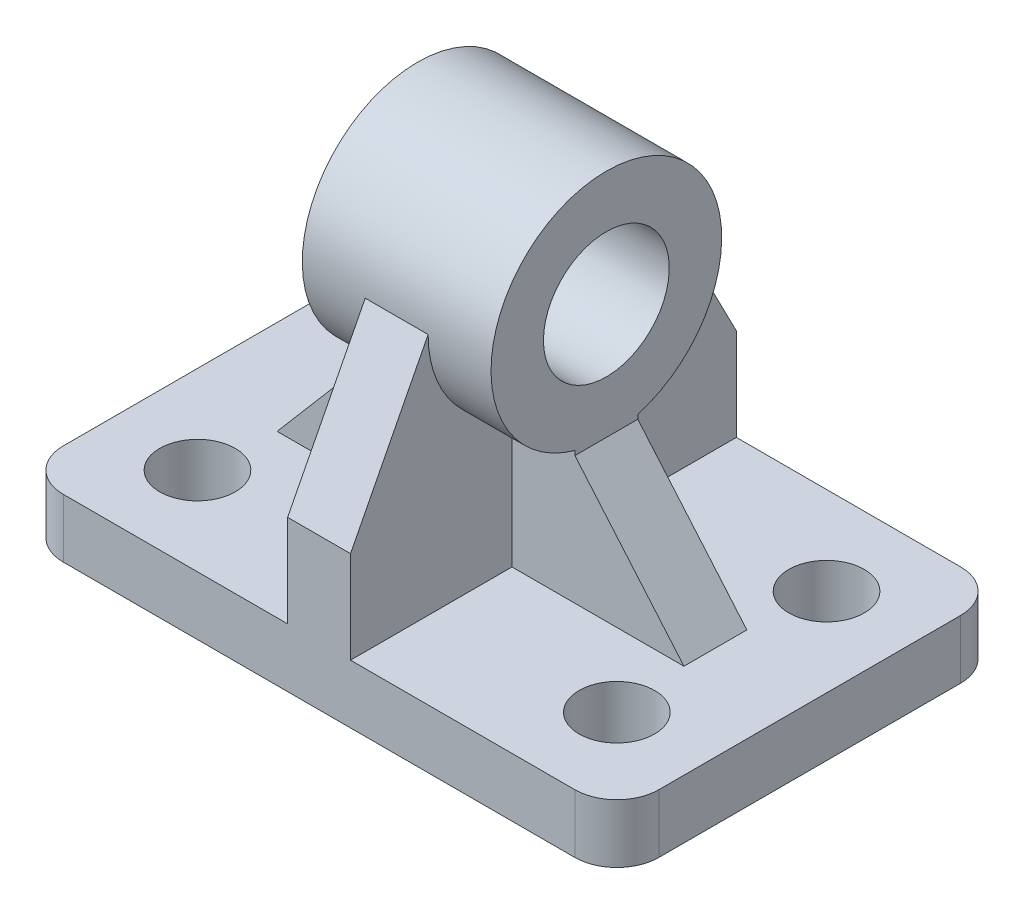
ISO-10303-21;
HEADER;
FILE_DESCRIPTION(('STEP AP214'),'2;1');
FILE_NAME('part.step','',(''),(''),'','','');
FILE_SCHEMA(('AUTOMOTIVE_DESIGN { 1 0 10303 214 1 1 1 1 }'));
ENDSEC;
DATA;
#1=APPLICATION_CONTEXT('core data for automotive mechanical design processes');
#2=APPLICATION_PROTOCOL_DEFINITION('international standard','automotive_design',2000,#1);
#3=PRODUCT_CONTEXT('',#1,'mechanical');
#4=PRODUCT('Part','Part','',(#3));
#5=PRODUCT_RELATED_PRODUCT_CATEGORY('part','',(#4));
#6=PRODUCT_DEFINITION_FORMATION('','',#4);
#7=PRODUCT_DEFINITION_CONTEXT('part definition',#1,'design');
#8=PRODUCT_DEFINITION('design','',#6,#7);
#9=PRODUCT_DEFINITION_SHAPE('','',#8);
#10=(LENGTH_UNIT() NAMED_UNIT(*) SI_UNIT(.MILLI.,.METRE.));
#11=(NAMED_UNIT(*) PLANE_ANGLE_UNIT() SI_UNIT($,.RADIAN.));
#12=(NAMED_UNIT(*) SI_UNIT($,.STERADIAN.) SOLID_ANGLE_UNIT());
#13=UNCERTAINTY_MEASURE_WITH_UNIT(LENGTH_MEASURE(1.E-05),#10,'distance_accuracy_value','');
#14=(GEOMETRIC_REPRESENTATION_CONTEXT(3) GLOBAL_UNCERTAINTY_ASSIGNED_CONTEXT((#13)) GLOBAL_UNIT_ASSIGNED_CONTEXT((#10,
#11,#12)) REPRESENTATION_CONTEXT('',''));
#15=CARTESIAN_POINT('',(0.,0.,0.));
#16=DIRECTION('',(0.,0.,1.));
#17=DIRECTION('',(1.,0.,0.));
#18=AXIS2_PLACEMENT_3D('',#15,#16,#17);
#19=CARTESIAN_POINT('',(0.,0.,7.5));
#20=DIRECTION('',(0.,0.,1.));
#21=DIRECTION('',(1.,0.,0.));
#22=AXIS2_PLACEMENT_3D('',#19,#20,#21);
#23=PLANE('',#22);
#24=DIRECTION('',(1.,0.,0.));
#25=VECTOR('',#24,1.);
#26=CARTESIAN_POINT('',(0.,14.,7.5));
#27=LINE('',#26,#25);
#28=CARTESIAN_POINT('',(-48.5,14.,7.5));
#29=VERTEX_POINT('',#28);
#30=CARTESIAN_POINT('',(-7.5,14.,7.5));
#31=VERTEX_POINT('',#30);
#32=EDGE_CURVE('E448',#29,#31,#27,.T.);
#33=ORIENTED_EDGE('',*,*,#32,.T.);
#34=DIRECTION('',(0.,-1.,0.));
#35=VECTOR('',#34,1.);
#36=CARTESIAN_POINT('',(-7.5,44.5,7.5));
#37=LINE('',#36,#35);
#38=CARTESIAN_POINT('',(-7.49999999999999,45.5424868893541,7.5));
#39=VERTEX_POINT('',#38);
#40=EDGE_CURVE('E239',#39,#31,#37,.T.);
#41=ORIENTED_EDGE('',*,*,#40,.F.);
#42=DIRECTION('',(-1.,0.,0.));
#43=VECTOR('',#42,1.);
#44=CARTESIAN_POINT('',(22.5,45.5424868893541,7.5));
#45=LINE('',#44,#43);
#46=CARTESIAN_POINT('',(-22.5,45.5424868893541,7.5));
#47=VERTEX_POINT('',#46);
#48=EDGE_CURVE('E331',#39,#47,#45,.T.);
#49=ORIENTED_EDGE('',*,*,#48,.T.);
#50=DIRECTION('',(0.,-1.,0.));
#51=VECTOR('',#50,1.);
#52=CARTESIAN_POINT('',(-22.5,44.5,7.5));
#53=LINE('',#52,#51);
#54=CARTESIAN_POINT('',(-22.5,44.5,7.5));
#55=VERTEX_POINT('',#54);
#56=EDGE_CURVE('E340',#47,#55,#53,.T.);
#57=ORIENTED_EDGE('',*,*,#56,.T.);
#58=DIRECTION('',(-0.648734176013877,-0.761015091093203,0.));
#59=VECTOR('',#58,1.);
#60=CARTESIAN_POINT('',(-22.5,44.5,7.5));
#61=LINE('',#60,#59);
#62=EDGE_CURVE('E343',#55,#29,#61,.T.);
#63=ORIENTED_EDGE('',*,*,#62,.T.);
#64=EDGE_LOOP('',(#33,#41,#49,#57,#63));
#65=FACE_BOUND('',#64,.T.);
#66=ADVANCED_FACE('F38',(#65),#23,.T.);
#67=CARTESIAN_POINT('',(0.,14.,0.));
#68=DIRECTION('',(0.,1.,0.));
#69=DIRECTION('',(0.,0.,1.));
#70=AXIS2_PLACEMENT_3D('',#67,#68,#69);
#71=PLANE('',#70);
#72=CARTESIAN_POINT('',(-50.,14.,25.));
#73=DIRECTION('',(0.,1.,0.));
#74=DIRECTION('',(0.,0.,-1.));
#75=AXIS2_PLACEMENT_3D('',#72,#73,#74);
#76=CIRCLE('',#75,9.);
#77=CARTESIAN_POINT('',(-50.,14.,16.));
#78=VERTEX_POINT('',#77);
#79=EDGE_CURVE('E557',#78,#78,#76,.T.);
#80=ORIENTED_EDGE('',*,*,#79,.F.);
#81=EDGE_LOOP('',(#80));
#82=FACE_BOUND('',#81,.T.);
#83=CARTESIAN_POINT('',(-50.,14.,-25.));
#84=DIRECTION('',(0.,1.,0.));
#85=DIRECTION('',(0.,0.,-1.));
#86=AXIS2_PLACEMENT_3D('',#83,#84,#85);
#87=CIRCLE('',#86,9.);
#88=CARTESIAN_POINT('',(-50.,14.,-34.));
#89=VERTEX_POINT('',#88);
#90=EDGE_CURVE('E565',#89,#89,#87,.T.);
#91=ORIENTED_EDGE('',*,*,#90,.F.);
#92=EDGE_LOOP('',(#91));
#93=FACE_BOUND('',#92,.T.);
#94=DIRECTION('',(1.,0.,0.));
#95=VECTOR('',#94,1.);
#96=CARTESIAN_POINT('',(-71.,14.,46.));
#97=LINE('',#96,#95);
#98=CARTESIAN_POINT('',(-61.,14.,46.));
#99=VERTEX_POINT('',#98);
#100=CARTESIAN_POINT('',(-7.49999999999999,14.,46.));
#101=VERTEX_POINT('',#100);
#102=EDGE_CURVE('E62',#99,#101,#97,.T.);
#103=ORIENTED_EDGE('',*,*,#102,.T.);
#104=DIRECTION('',(0.,0.,1.));
#105=VECTOR('',#104,1.);
#106=CARTESIAN_POINT('',(-7.5,14.,36.));
#107=LINE('',#106,#105);
#108=EDGE_CURVE('E244',#31,#101,#107,.T.);
#109=ORIENTED_EDGE('',*,*,#108,.F.);
#110=ORIENTED_EDGE('',*,*,#32,.F.);
#111=DIRECTION('',(0.,0.,-1.));
#112=VECTOR('',#111,1.);
#113=CARTESIAN_POINT('',(-48.5,14.,7.5));
#114=LINE('',#113,#112);
#115=CARTESIAN_POINT('',(-48.5,14.,-7.5));
#116=VERTEX_POINT('',#115);
#117=EDGE_CURVE('E347',#29,#116,#114,.T.);
#118=ORIENTED_EDGE('',*,*,#117,.T.);
#119=DIRECTION('',(1.,0.,0.));
#120=VECTOR('',#119,1.);
#121=CARTESIAN_POINT('',(0.,14.,-7.5));
#122=LINE('',#121,#120);
#123=CARTESIAN_POINT('',(-7.5,14.,-7.5));
#124=VERTEX_POINT('',#123);
#125=EDGE_CURVE('E444',#116,#124,#122,.T.);
#126=ORIENTED_EDGE('',*,*,#125,.T.);
#127=DIRECTION('',(0.,0.,-1.));
#128=VECTOR('',#127,1.);
#129=CARTESIAN_POINT('',(-7.5,14.,-36.));
#130=LINE('',#129,#128);
#131=CARTESIAN_POINT('',(-7.49999999999999,14.,-46.));
#132=VERTEX_POINT('',#131);
#133=EDGE_CURVE('E280',#124,#132,#130,.T.);
#134=ORIENTED_EDGE('',*,*,#133,.T.);
#135=DIRECTION('',(-1.,0.,0.));
#136=VECTOR('',#135,1.);
#137=CARTESIAN_POINT('',(-71.,14.,-46.));
#138=LINE('',#137,#136);
#139=CARTESIAN_POINT('',(-61.,14.,-46.));
#140=VERTEX_POINT('',#139);
#141=EDGE_CURVE('E372',#132,#140,#138,.T.);
#142=ORIENTED_EDGE('',*,*,#141,.T.);
#143=CARTESIAN_POINT('',(-61.,14.,-36.));
#144=DIRECTION('',(0.,1.,0.));
#145=DIRECTION('',(0.,0.,1.));
#146=AXIS2_PLACEMENT_3D('',#143,#144,#145);
#147=CIRCLE('',#146,10.);
#148=CARTESIAN_POINT('',(-71.,14.,-36.));
#149=VERTEX_POINT('',#148);
#150=EDGE_CURVE('E426',#140,#149,#147,.T.);
#151=ORIENTED_EDGE('',*,*,#150,.T.);
#152=DIRECTION('',(0.,0.,1.));
#153=VECTOR('',#152,1.);
#154=CARTESIAN_POINT('',(-71.,14.,-46.));
#155=LINE('',#154,#153);
#156=CARTESIAN_POINT('',(-71.,14.,36.));
#157=VERTEX_POINT('',#156);
#158=EDGE_CURVE('E361',#149,#157,#155,.T.);
#159=ORIENTED_EDGE('',*,*,#158,.T.);
#160=CARTESIAN_POINT('',(-61.,14.,36.));
#161=DIRECTION('',(0.,1.,0.));
#162=DIRECTION('',(0.,0.,1.));
#163=AXIS2_PLACEMENT_3D('',#160,#161,#162);
#164=CIRCLE('',#163,10.);
#165=EDGE_CURVE('E420',#157,#99,#164,.T.);
#166=ORIENTED_EDGE('',*,*,#165,.T.);
#167=EDGE_LOOP('',(#103,#109,#110,#118,#126,#134,#142,#151,#159,#166));
#168=FACE_BOUND('',#167,.T.);
#169=ADVANCED_FACE('F490',(#82,#93,#168),#71,.T.);
#170=CARTESIAN_POINT('',(0.,0.,-7.5));
#171=DIRECTION('',(0.,0.,1.));
#172=DIRECTION('',(1.,0.,0.));
#173=AXIS2_PLACEMENT_3D('',#170,#171,#172);
#174=PLANE('',#173);
#175=DIRECTION('',(0.,-1.,0.));
#176=VECTOR('',#175,1.);
#177=CARTESIAN_POINT('',(-7.5,44.5,-7.5));
#178=LINE('',#177,#176);
#179=CARTESIAN_POINT('',(-7.49999999999999,45.5424868893541,-7.5));
#180=VERTEX_POINT('',#179);
#181=EDGE_CURVE('E277',#180,#124,#178,.T.);
#182=ORIENTED_EDGE('',*,*,#181,.T.);
#183=ORIENTED_EDGE('',*,*,#125,.F.);
#184=DIRECTION('',(-0.648734176013877,-0.761015091093203,0.));
#185=VECTOR('',#184,1.);
#186=CARTESIAN_POINT('',(-22.5,44.5,-7.5));
#187=LINE('',#186,#185);
#188=CARTESIAN_POINT('',(-22.5,44.5,-7.5));
#189=VERTEX_POINT('',#188);
#190=EDGE_CURVE('E344',#189,#116,#187,.T.);
#191=ORIENTED_EDGE('',*,*,#190,.F.);
#192=DIRECTION('',(0.,-1.,0.));
#193=VECTOR('',#192,1.);
#194=CARTESIAN_POINT('',(-22.5,44.5,-7.5));
#195=LINE('',#194,#193);
#196=CARTESIAN_POINT('',(-22.5,45.5424868893541,-7.5));
#197=VERTEX_POINT('',#196);
#198=EDGE_CURVE('E339',#197,#189,#195,.T.);
#199=ORIENTED_EDGE('',*,*,#198,.F.);
#200=DIRECTION('',(-1.,0.,0.));
#201=VECTOR('',#200,1.);
#202=CARTESIAN_POINT('',(22.5,45.5424868893541,-7.5));
#203=LINE('',#202,#201);
#204=EDGE_CURVE('E47',#180,#197,#203,.T.);
#205=ORIENTED_EDGE('',*,*,#204,.F.);
#206=EDGE_LOOP('',(#182,#183,#191,#199,#205));
#207=FACE_BOUND('',#206,.T.);
#208=ADVANCED_FACE('F486',(#207),#174,.F.);
#209=DIRECTION('',(0.,-1.,0.));
#210=VECTOR('',#209,1.);
#211=CARTESIAN_POINT('',(7.5,44.5,7.5));
#212=LINE('',#211,#210);
#213=CARTESIAN_POINT('',(7.5,45.5424868893541,7.5));
#214=VERTEX_POINT('',#213);
#215=CARTESIAN_POINT('',(7.5,14.,7.5));
#216=VERTEX_POINT('',#215);
#217=EDGE_CURVE('E231',#214,#216,#212,.T.);
#218=ORIENTED_EDGE('',*,*,#217,.T.);
#219=CARTESIAN_POINT('',(48.5,14.,7.5));
#220=VERTEX_POINT('',#219);
#221=EDGE_CURVE('E447',#216,#220,#27,.T.);
#222=ORIENTED_EDGE('',*,*,#221,.T.);
#223=DIRECTION('',(0.648734176013877,-0.761015091093203,0.));
#224=VECTOR('',#223,1.);
#225=CARTESIAN_POINT('',(22.5,44.5,7.5));
#226=LINE('',#225,#224);
#227=CARTESIAN_POINT('',(22.5,44.5,7.5));
#228=VERTEX_POINT('',#227);
#229=EDGE_CURVE('E300',#228,#220,#226,.T.);
#230=ORIENTED_EDGE('',*,*,#229,.F.);
#231=DIRECTION('',(0.,-1.,0.));
#232=VECTOR('',#231,1.);
#233=CARTESIAN_POINT('',(22.5,44.5,7.5));
#234=LINE('',#233,#232);
#235=CARTESIAN_POINT('',(22.5,45.5424868893541,7.5));
#236=VERTEX_POINT('',#235);
#237=EDGE_CURVE('E296',#236,#228,#234,.T.);
#238=ORIENTED_EDGE('',*,*,#237,.F.);
#239=EDGE_CURVE('E335',#236,#214,#45,.T.);
#240=ORIENTED_EDGE('',*,*,#239,.T.);
#241=EDGE_LOOP('',(#218,#222,#230,#238,#240));
#242=FACE_BOUND('',#241,.T.);
#243=ADVANCED_FACE('F458',(#242),#23,.T.);
#244=CARTESIAN_POINT('',(7.5,14.,-7.5));
#245=VERTEX_POINT('',#244);
#246=CARTESIAN_POINT('',(48.5,14.,-7.5));
#247=VERTEX_POINT('',#246);
#248=EDGE_CURVE('E443',#245,#247,#122,.T.);
#249=ORIENTED_EDGE('',*,*,#248,.F.);
#250=DIRECTION('',(0.,-1.,0.));
#251=VECTOR('',#250,1.);
#252=CARTESIAN_POINT('',(7.5,44.5,-7.5));
#253=LINE('',#252,#251);
#254=CARTESIAN_POINT('',(7.5,45.5424868893541,-7.5));
#255=VERTEX_POINT('',#254);
#256=EDGE_CURVE('E258',#255,#245,#253,.T.);
#257=ORIENTED_EDGE('',*,*,#256,.F.);
#258=CARTESIAN_POINT('',(22.5,45.5424868893541,-7.5));
#259=VERTEX_POINT('',#258);
#260=EDGE_CURVE('E11',#259,#255,#203,.T.);
#261=ORIENTED_EDGE('',*,*,#260,.F.);
#262=DIRECTION('',(0.,-1.,0.));
#263=VECTOR('',#262,1.);
#264=CARTESIAN_POINT('',(22.5,44.5,-7.5));
#265=LINE('',#264,#263);
#266=CARTESIAN_POINT('',(22.5,44.5,-7.5));
#267=VERTEX_POINT('',#266);
#268=EDGE_CURVE('E295',#259,#267,#265,.T.);
#269=ORIENTED_EDGE('',*,*,#268,.T.);
#270=DIRECTION('',(0.648734176013877,-0.761015091093203,0.));
#271=VECTOR('',#270,1.);
#272=CARTESIAN_POINT('',(22.5,44.5,-7.5));
#273=LINE('',#272,#271);
#274=EDGE_CURVE('E301',#267,#247,#273,.T.);
#275=ORIENTED_EDGE('',*,*,#274,.T.);
#276=EDGE_LOOP('',(#249,#257,#261,#269,#275));
#277=FACE_BOUND('',#276,.T.);
#278=ADVANCED_FACE('F541',(#277),#174,.F.);
#279=CARTESIAN_POINT('',(-71.,14.,-46.));
#280=DIRECTION('',(1.,0.,0.));
#281=DIRECTION('',(0.,0.,-1.));
#282=AXIS2_PLACEMENT_3D('',#279,#280,#281);
#283=PLANE('',#282);
#284=ORIENTED_EDGE('',*,*,#158,.F.);
#285=DIRECTION('',(0.,-1.,0.));
#286=VECTOR('',#285,1.);
#287=CARTESIAN_POINT('',(-71.,14.,-36.));
#288=LINE('',#287,#286);
#289=CARTESIAN_POINT('',(-71.,0.,-36.));
#290=VERTEX_POINT('',#289);
#291=EDGE_CURVE('E393',#149,#290,#288,.T.);
#292=ORIENTED_EDGE('',*,*,#291,.T.);
#293=DIRECTION('',(0.,0.,1.));
#294=VECTOR('',#293,1.);
#295=CARTESIAN_POINT('',(-71.,0.,-46.));
#296=LINE('',#295,#294);
#297=CARTESIAN_POINT('',(-71.,0.,36.));
#298=VERTEX_POINT('',#297);
#299=EDGE_CURVE('E360',#290,#298,#296,.T.);
#300=ORIENTED_EDGE('',*,*,#299,.T.);
#301=DIRECTION('',(0.,-1.,0.));
#302=VECTOR('',#301,1.);
#303=CARTESIAN_POINT('',(-71.,14.,36.));
#304=LINE('',#303,#302);
#305=EDGE_CURVE('E376',#298,#157,#304,.F.);
#306=ORIENTED_EDGE('',*,*,#305,.T.);
#307=EDGE_LOOP('',(#284,#292,#300,#306));
#308=FACE_BOUND('',#307,.T.);
#309=ADVANCED_FACE('F505',(#308),#283,.F.);
#310=CARTESIAN_POINT('',(-71.,14.,46.));
#311=DIRECTION('',(0.,0.,-1.));
#312=DIRECTION('',(-1.,0.,0.));
#313=AXIS2_PLACEMENT_3D('',#310,#311,#312);
#314=PLANE('',#313);
#315=ORIENTED_EDGE('',*,*,#102,.F.);
#316=DIRECTION('',(0.,-1.,0.));
#317=VECTOR('',#316,1.);
#318=CARTESIAN_POINT('',(-61.,14.,46.));
#319=LINE('',#318,#317);
#320=CARTESIAN_POINT('',(-61.,0.,46.));
#321=VERTEX_POINT('',#320);
#322=EDGE_CURVE('E439',#99,#321,#319,.T.);
#323=ORIENTED_EDGE('',*,*,#322,.T.);
#324=DIRECTION('',(1.,0.,0.));
#325=VECTOR('',#324,1.);
#326=CARTESIAN_POINT('',(-71.,0.,46.));
#327=LINE('',#326,#325);
#328=CARTESIAN_POINT('',(61.,0.,46.));
#329=VERTEX_POINT('',#328);
#330=EDGE_CURVE('E380',#321,#329,#327,.T.);
#331=ORIENTED_EDGE('',*,*,#330,.T.);
#332=DIRECTION('',(0.,-1.,0.));
#333=VECTOR('',#332,1.);
#334=CARTESIAN_POINT('',(61.,14.,46.));
#335=LINE('',#334,#333);
#336=CARTESIAN_POINT('',(61.,14.,46.));
#337=VERTEX_POINT('',#336);
#338=EDGE_CURVE('E436',#329,#337,#335,.F.);
#339=ORIENTED_EDGE('',*,*,#338,.T.);
#340=CARTESIAN_POINT('',(7.49999999999999,14.,46.));
#341=VERTEX_POINT('',#340);
#342=EDGE_CURVE('E227',#341,#337,#97,.T.);
#343=ORIENTED_EDGE('',*,*,#342,.F.);
#344=DIRECTION('',(0.,1.,0.));
#345=VECTOR('',#344,1.);
#346=CARTESIAN_POINT('',(7.5,14.,46.));
#347=LINE('',#346,#345);
#348=CARTESIAN_POINT('',(7.5,36.,46.));
#349=VERTEX_POINT('',#348);
#350=EDGE_CURVE('E206',#341,#349,#347,.T.);
#351=ORIENTED_EDGE('',*,*,#350,.T.);
#352=DIRECTION('',(-1.,0.,0.));
#353=VECTOR('',#352,1.);
#354=CARTESIAN_POINT('',(7.5,36.,46.));
#355=LINE('',#354,#353);
#356=CARTESIAN_POINT('',(-7.5,36.,46.));
#357=VERTEX_POINT('',#356);
#358=EDGE_CURVE('E215',#349,#357,#355,.T.);
#359=ORIENTED_EDGE('',*,*,#358,.T.);
#360=DIRECTION('',(0.,1.,0.));
#361=VECTOR('',#360,1.);
#362=CARTESIAN_POINT('',(-7.5,14.,46.));
#363=LINE('',#362,#361);
#364=EDGE_CURVE('E247',#101,#357,#363,.T.);
#365=ORIENTED_EDGE('',*,*,#364,.F.);
#366=EDGE_LOOP('',(#315,#323,#331,#339,#343,#351,#359,#365));
#367=FACE_BOUND('',#366,.T.);
#368=ADVANCED_FACE('F225',(#367),#314,.F.);
#369=CARTESIAN_POINT('',(71.,14.,-46.));
#370=DIRECTION('',(-1.,0.,0.));
#371=DIRECTION('',(0.,0.,1.));
#372=AXIS2_PLACEMENT_3D('',#369,#370,#371);
#373=PLANE('',#372);
#374=DIRECTION('',(0.,0.,-1.));
#375=VECTOR('',#374,1.);
#376=CARTESIAN_POINT('',(71.,0.,-46.));
#377=LINE('',#376,#375);
#378=CARTESIAN_POINT('',(71.,0.,36.));
#379=VERTEX_POINT('',#378);
#380=CARTESIAN_POINT('',(71.,0.,-36.));
#381=VERTEX_POINT('',#380);
#382=EDGE_CURVE('E384',#379,#381,#377,.T.);
#383=ORIENTED_EDGE('',*,*,#382,.T.);
#384=DIRECTION('',(0.,-1.,0.));
#385=VECTOR('',#384,1.);
#386=CARTESIAN_POINT('',(71.,14.,-36.));
#387=LINE('',#386,#385);
#388=CARTESIAN_POINT('',(71.,14.,-36.));
#389=VERTEX_POINT('',#388);
#390=EDGE_CURVE('E433',#381,#389,#387,.F.);
#391=ORIENTED_EDGE('',*,*,#390,.T.);
#392=DIRECTION('',(0.,0.,-1.));
#393=VECTOR('',#392,1.);
#394=CARTESIAN_POINT('',(71.,14.,-46.));
#395=LINE('',#394,#393);
#396=CARTESIAN_POINT('',(71.,14.,36.));
#397=VERTEX_POINT('',#396);
#398=EDGE_CURVE('E368',#397,#389,#395,.T.);
#399=ORIENTED_EDGE('',*,*,#398,.F.);
#400=DIRECTION('',(0.,-1.,0.));
#401=VECTOR('',#400,1.);
#402=CARTESIAN_POINT('',(71.,14.,36.));
#403=LINE('',#402,#401);
#404=EDGE_CURVE('E429',#397,#379,#403,.T.);
#405=ORIENTED_EDGE('',*,*,#404,.T.);
#406=EDGE_LOOP('',(#383,#391,#399,#405));
#407=FACE_BOUND('',#406,.T.);
#408=ADVANCED_FACE('F524',(#407),#373,.F.);
#409=CARTESIAN_POINT('',(-71.,14.,-46.));
#410=DIRECTION('',(0.,0.,1.));
#411=DIRECTION('',(1.,0.,0.));
#412=AXIS2_PLACEMENT_3D('',#409,#410,#411);
#413=PLANE('',#412);
#414=DIRECTION('',(0.,1.,0.));
#415=VECTOR('',#414,1.);
#416=CARTESIAN_POINT('',(7.5,14.,-46.));
#417=LINE('',#416,#415);
#418=CARTESIAN_POINT('',(7.49999999999999,14.,-46.));
#419=VERTEX_POINT('',#418);
#420=CARTESIAN_POINT('',(7.5,36.,-46.));
#421=VERTEX_POINT('',#420);
#422=EDGE_CURVE('E267',#419,#421,#417,.T.);
#423=ORIENTED_EDGE('',*,*,#422,.F.);
#424=CARTESIAN_POINT('',(61.,14.,-46.));
#425=VERTEX_POINT('',#424);
#426=EDGE_CURVE('E373',#425,#419,#138,.T.);
#427=ORIENTED_EDGE('',*,*,#426,.F.);
#428=DIRECTION('',(0.,-1.,0.));
#429=VECTOR('',#428,1.);
#430=CARTESIAN_POINT('',(61.,14.,-46.));
#431=LINE('',#430,#429);
#432=CARTESIAN_POINT('',(61.,0.,-46.));
#433=VERTEX_POINT('',#432);
#434=EDGE_CURVE('E409',#425,#433,#431,.T.);
#435=ORIENTED_EDGE('',*,*,#434,.T.);
#436=DIRECTION('',(-1.,0.,0.));
#437=VECTOR('',#436,1.);
#438=CARTESIAN_POINT('',(-71.,0.,-46.));
#439=LINE('',#438,#437);
#440=CARTESIAN_POINT('',(-61.,0.,-46.));
#441=VERTEX_POINT('',#440);
#442=EDGE_CURVE('E365',#433,#441,#439,.T.);
#443=ORIENTED_EDGE('',*,*,#442,.T.);
#444=DIRECTION('',(0.,-1.,0.));
#445=VECTOR('',#444,1.);
#446=CARTESIAN_POINT('',(-61.,14.,-46.));
#447=LINE('',#446,#445);
#448=EDGE_CURVE('E413',#441,#140,#447,.F.);
#449=ORIENTED_EDGE('',*,*,#448,.T.);
#450=ORIENTED_EDGE('',*,*,#141,.F.);
#451=DIRECTION('',(0.,1.,0.));
#452=VECTOR('',#451,1.);
#453=CARTESIAN_POINT('',(-7.5,14.,-46.));
#454=LINE('',#453,#452);
#455=CARTESIAN_POINT('',(-7.5,36.,-46.));
#456=VERTEX_POINT('',#455);
#457=EDGE_CURVE('E283',#132,#456,#454,.T.);
#458=ORIENTED_EDGE('',*,*,#457,.T.);
#459=DIRECTION('',(-1.,0.,0.));
#460=VECTOR('',#459,1.);
#461=CARTESIAN_POINT('',(7.5,36.,-46.));
#462=LINE('',#461,#460);
#463=EDGE_CURVE('E291',#421,#456,#462,.T.);
#464=ORIENTED_EDGE('',*,*,#463,.F.);
#465=EDGE_LOOP('',(#423,#427,#435,#443,#449,#450,#458,#464));
#466=FACE_BOUND('',#465,.T.);
#467=ADVANCED_FACE('F514',(#466),#413,.F.);
#468=CARTESIAN_POINT('',(50.,14.,-25.));
#469=DIRECTION('',(0.,1.,0.));
#470=DIRECTION('',(0.,0.,1.));
#471=AXIS2_PLACEMENT_3D('',#468,#469,#470);
#472=CIRCLE('',#471,9.);
#473=CARTESIAN_POINT('',(50.,14.,-16.));
#474=VERTEX_POINT('',#473);
#475=EDGE_CURVE('E573',#474,#474,#472,.T.);
#476=ORIENTED_EDGE('',*,*,#475,.F.);
#477=EDGE_LOOP('',(#476));
#478=FACE_BOUND('',#477,.T.);
#479=CARTESIAN_POINT('',(50.,14.,25.));
#480=DIRECTION('',(0.,1.,0.));
#481=DIRECTION('',(0.,0.,1.));
#482=AXIS2_PLACEMENT_3D('',#479,#480,#481);
#483=CIRCLE('',#482,9.);
#484=CARTESIAN_POINT('',(50.,14.,34.));
#485=VERTEX_POINT('',#484);
#486=EDGE_CURVE('E549',#485,#485,#483,.T.);
#487=ORIENTED_EDGE('',*,*,#486,.F.);
#488=EDGE_LOOP('',(#487));
#489=FACE_BOUND('',#488,.T.);
#490=DIRECTION('',(0.,0.,1.));
#491=VECTOR('',#490,1.);
#492=CARTESIAN_POINT('',(7.5,14.,7.5));
#493=LINE('',#492,#491);
#494=EDGE_CURVE('E54',#216,#341,#493,.T.);
#495=ORIENTED_EDGE('',*,*,#494,.T.);
#496=ORIENTED_EDGE('',*,*,#342,.T.);
#497=CARTESIAN_POINT('',(61.,14.,36.));
#498=DIRECTION('',(0.,1.,0.));
#499=DIRECTION('',(0.,0.,1.));
#500=AXIS2_PLACEMENT_3D('',#497,#498,#499);
#501=CIRCLE('',#500,10.);
#502=EDGE_CURVE('E417',#337,#397,#501,.T.);
#503=ORIENTED_EDGE('',*,*,#502,.T.);
#504=ORIENTED_EDGE('',*,*,#398,.T.);
#505=CARTESIAN_POINT('',(61.,14.,-36.));
#506=DIRECTION('',(0.,1.,0.));
#507=DIRECTION('',(0.,0.,1.));
#508=AXIS2_PLACEMENT_3D('',#505,#506,#507);
#509=CIRCLE('',#508,10.);
#510=EDGE_CURVE('E423',#389,#425,#509,.T.);
#511=ORIENTED_EDGE('',*,*,#510,.T.);
#512=ORIENTED_EDGE('',*,*,#426,.T.);
#513=DIRECTION('',(0.,0.,-1.));
#514=VECTOR('',#513,1.);
#515=CARTESIAN_POINT('',(7.5,14.,-7.5));
#516=LINE('',#515,#514);
#517=EDGE_CURVE('E263',#245,#419,#516,.T.);
#518=ORIENTED_EDGE('',*,*,#517,.F.);
#519=ORIENTED_EDGE('',*,*,#248,.T.);
#520=DIRECTION('',(0.,0.,-1.));
#521=VECTOR('',#520,1.);
#522=CARTESIAN_POINT('',(48.5,14.,7.5));
#523=LINE('',#522,#521);
#524=EDGE_CURVE('E305',#220,#247,#523,.T.);
#525=ORIENTED_EDGE('',*,*,#524,.F.);
#526=ORIENTED_EDGE('',*,*,#221,.F.);
#527=EDGE_LOOP('',(#495,#496,#503,#504,#511,#512,#518,#519,#525,#526));
#528=FACE_BOUND('',#527,.T.);
#529=ADVANCED_FACE('F464',(#478,#489,#528),#71,.T.);
#530=CARTESIAN_POINT('',(0.,0.,0.));
#531=DIRECTION('',(0.,1.,0.));
#532=DIRECTION('',(0.,0.,1.));
#533=AXIS2_PLACEMENT_3D('',#530,#531,#532);
#534=PLANE('',#533);
#535=CARTESIAN_POINT('',(-50.,0.,25.));
#536=DIRECTION('',(0.,1.,0.));
#537=DIRECTION('',(0.,0.,-1.));
#538=AXIS2_PLACEMENT_3D('',#535,#536,#537);
#539=CIRCLE('',#538,9.);
#540=CARTESIAN_POINT('',(-50.,0.,16.));
#541=VERTEX_POINT('',#540);
#542=EDGE_CURVE('E561',#541,#541,#539,.T.);
#543=ORIENTED_EDGE('',*,*,#542,.T.);
#544=EDGE_LOOP('',(#543));
#545=FACE_BOUND('',#544,.T.);
#546=CARTESIAN_POINT('',(-50.,0.,-25.));
#547=DIRECTION('',(0.,1.,0.));
#548=DIRECTION('',(0.,0.,-1.));
#549=AXIS2_PLACEMENT_3D('',#546,#547,#548);
#550=CIRCLE('',#549,9.);
#551=CARTESIAN_POINT('',(-50.,0.,-34.));
#552=VERTEX_POINT('',#551);
#553=EDGE_CURVE('E569',#552,#552,#550,.T.);
#554=ORIENTED_EDGE('',*,*,#553,.T.);
#555=EDGE_LOOP('',(#554));
#556=FACE_BOUND('',#555,.T.);
#557=CARTESIAN_POINT('',(50.,0.,-25.));
#558=DIRECTION('',(0.,1.,0.));
#559=DIRECTION('',(0.,0.,1.));
#560=AXIS2_PLACEMENT_3D('',#557,#558,#559);
#561=CIRCLE('',#560,9.);
#562=CARTESIAN_POINT('',(50.,0.,-16.));
#563=VERTEX_POINT('',#562);
#564=EDGE_CURVE('E553',#563,#563,#561,.T.);
#565=ORIENTED_EDGE('',*,*,#564,.T.);
#566=EDGE_LOOP('',(#565));
#567=FACE_BOUND('',#566,.T.);
#568=CARTESIAN_POINT('',(50.,0.,25.));
#569=DIRECTION('',(0.,1.,0.));
#570=DIRECTION('',(0.,0.,1.));
#571=AXIS2_PLACEMENT_3D('',#568,#569,#570);
#572=CIRCLE('',#571,9.);
#573=CARTESIAN_POINT('',(50.,0.,34.));
#574=VERTEX_POINT('',#573);
#575=EDGE_CURVE('E240',#574,#574,#572,.T.);
#576=ORIENTED_EDGE('',*,*,#575,.T.);
#577=EDGE_LOOP('',(#576));
#578=FACE_BOUND('',#577,.T.);
#579=ORIENTED_EDGE('',*,*,#299,.F.);
#580=CARTESIAN_POINT('',(-61.,0.,-36.));
#581=DIRECTION('',(0.,1.,0.));
#582=DIRECTION('',(0.,0.,1.));
#583=AXIS2_PLACEMENT_3D('',#580,#581,#582);
#584=CIRCLE('',#583,10.);
#585=EDGE_CURVE('E406',#290,#441,#584,.F.);
#586=ORIENTED_EDGE('',*,*,#585,.T.);
#587=ORIENTED_EDGE('',*,*,#442,.F.);
#588=CARTESIAN_POINT('',(61.,0.,-36.));
#589=DIRECTION('',(0.,1.,0.));
#590=DIRECTION('',(0.,0.,1.));
#591=AXIS2_PLACEMENT_3D('',#588,#589,#590);
#592=CIRCLE('',#591,10.);
#593=EDGE_CURVE('E403',#433,#381,#592,.F.);
#594=ORIENTED_EDGE('',*,*,#593,.T.);
#595=ORIENTED_EDGE('',*,*,#382,.F.);
#596=CARTESIAN_POINT('',(61.,0.,36.));
#597=DIRECTION('',(0.,1.,0.));
#598=DIRECTION('',(0.,0.,1.));
#599=AXIS2_PLACEMENT_3D('',#596,#597,#598);
#600=CIRCLE('',#599,10.);
#601=EDGE_CURVE('E397',#379,#329,#600,.F.);
#602=ORIENTED_EDGE('',*,*,#601,.T.);
#603=ORIENTED_EDGE('',*,*,#330,.F.);
#604=CARTESIAN_POINT('',(-61.,0.,36.));
#605=DIRECTION('',(0.,1.,0.));
#606=DIRECTION('',(0.,0.,1.));
#607=AXIS2_PLACEMENT_3D('',#604,#605,#606);
#608=CIRCLE('',#607,10.);
#609=EDGE_CURVE('E400',#321,#298,#608,.F.);
#610=ORIENTED_EDGE('',*,*,#609,.T.);
#611=EDGE_LOOP('',(#579,#586,#587,#594,#595,#602,#603,#610));
#612=FACE_BOUND('',#611,.T.);
#613=ADVANCED_FACE('F502',(#545,#556,#567,#578,#612),#534,.F.);
#614=CARTESIAN_POINT('',(-61.,14.,-36.));
#615=DIRECTION('',(0.,-1.,0.));
#616=DIRECTION('',(0.,0.,-1.));
#617=AXIS2_PLACEMENT_3D('',#614,#615,#616);
#618=CYLINDRICAL_SURFACE('',#617,10.);
#619=ORIENTED_EDGE('',*,*,#150,.F.);
#620=ORIENTED_EDGE('',*,*,#448,.F.);
#621=ORIENTED_EDGE('',*,*,#585,.F.);
#622=ORIENTED_EDGE('',*,*,#291,.F.);
#623=EDGE_LOOP('',(#619,#620,#621,#622));
#624=FACE_BOUND('',#623,.T.);
#625=ADVANCED_FACE('F509',(#624),#618,.T.);
#626=CARTESIAN_POINT('',(61.,14.,-36.));
#627=DIRECTION('',(0.,-1.,0.));
#628=DIRECTION('',(0.,0.,-1.));
#629=AXIS2_PLACEMENT_3D('',#626,#627,#628);
#630=CYLINDRICAL_SURFACE('',#629,10.);
#631=ORIENTED_EDGE('',*,*,#510,.F.);
#632=ORIENTED_EDGE('',*,*,#390,.F.);
#633=ORIENTED_EDGE('',*,*,#593,.F.);
#634=ORIENTED_EDGE('',*,*,#434,.F.);
#635=EDGE_LOOP('',(#631,#632,#633,#634));
#636=FACE_BOUND('',#635,.T.);
#637=ADVANCED_FACE('F520',(#636),#630,.T.);
#638=CARTESIAN_POINT('',(-61.,14.,36.));
#639=DIRECTION('',(0.,-1.,0.));
#640=DIRECTION('',(0.,0.,-1.));
#641=AXIS2_PLACEMENT_3D('',#638,#639,#640);
#642=CYLINDRICAL_SURFACE('',#641,10.);
#643=ORIENTED_EDGE('',*,*,#165,.F.);
#644=ORIENTED_EDGE('',*,*,#305,.F.);
#645=ORIENTED_EDGE('',*,*,#609,.F.);
#646=ORIENTED_EDGE('',*,*,#322,.F.);
#647=EDGE_LOOP('',(#643,#644,#645,#646));
#648=FACE_BOUND('',#647,.T.);
#649=ADVANCED_FACE('F498',(#648),#642,.T.);
#650=CARTESIAN_POINT('',(61.,14.,36.));
#651=DIRECTION('',(0.,-1.,0.));
#652=DIRECTION('',(0.,0.,-1.));
#653=AXIS2_PLACEMENT_3D('',#650,#651,#652);
#654=CYLINDRICAL_SURFACE('',#653,10.);
#655=ORIENTED_EDGE('',*,*,#502,.F.);
#656=ORIENTED_EDGE('',*,*,#338,.F.);
#657=ORIENTED_EDGE('',*,*,#601,.F.);
#658=ORIENTED_EDGE('',*,*,#404,.F.);
#659=EDGE_LOOP('',(#655,#656,#657,#658));
#660=FACE_BOUND('',#659,.T.);
#661=ADVANCED_FACE('F40',(#660),#654,.T.);
#662=CARTESIAN_POINT('',(-22.5,44.5,7.5));
#663=DIRECTION('',(1.,0.,0.));
#664=DIRECTION('',(0.,0.,-1.));
#665=AXIS2_PLACEMENT_3D('',#662,#663,#664);
#666=PLANE('',#665);
#667=CARTESIAN_POINT('',(-22.5,72.,0.));
#668=DIRECTION('',(1.,0.,0.));
#669=DIRECTION('',(0.,0.,-1.));
#670=AXIS2_PLACEMENT_3D('',#667,#668,#669);
#671=CIRCLE('',#670,27.5);
#672=EDGE_CURVE('E323',#197,#47,#671,.T.);
#673=ORIENTED_EDGE('',*,*,#672,.F.);
#674=ORIENTED_EDGE('',*,*,#198,.T.);
#675=DIRECTION('',(0.,0.,-1.));
#676=VECTOR('',#675,1.);
#677=CARTESIAN_POINT('',(-22.5,44.5,7.5));
#678=LINE('',#677,#676);
#679=EDGE_CURVE('E357',#55,#189,#678,.T.);
#680=ORIENTED_EDGE('',*,*,#679,.F.);
#681=ORIENTED_EDGE('',*,*,#56,.F.);
#682=EDGE_LOOP('',(#673,#674,#680,#681));
#683=FACE_BOUND('',#682,.T.);
#684=CARTESIAN_POINT('',(-22.5,72.,0.));
#685=DIRECTION('',(1.,0.,0.));
#686=DIRECTION('',(0.,0.,-1.));
#687=AXIS2_PLACEMENT_3D('',#684,#685,#686);
#688=CIRCLE('',#687,15.);
#689=CARTESIAN_POINT('',(-22.5,72.,15.));
#690=VERTEX_POINT('',#689);
#691=EDGE_CURVE('E318',#690,#690,#688,.T.);
#692=ORIENTED_EDGE('',*,*,#691,.T.);
#693=EDGE_LOOP('',(#692));
#694=FACE_BOUND('',#693,.T.);
#695=ADVANCED_FACE('F476',(#683,#694),#666,.F.);
#696=CARTESIAN_POINT('',(-22.5,44.5,7.5));
#697=DIRECTION('',(0.761015091093203,-0.648734176013877,0.));
#698=DIRECTION('',(0.648734176013878,0.761015091093203,0.));
#699=AXIS2_PLACEMENT_3D('',#696,#697,#698);
#700=PLANE('',#699);
#701=ORIENTED_EDGE('',*,*,#190,.T.);
#702=ORIENTED_EDGE('',*,*,#117,.F.);
#703=ORIENTED_EDGE('',*,*,#62,.F.);
#704=ORIENTED_EDGE('',*,*,#679,.T.);
#705=EDGE_LOOP('',(#701,#702,#703,#704));
#706=FACE_BOUND('',#705,.T.);
#707=ADVANCED_FACE('F489',(#706),#700,.F.);
#708=CARTESIAN_POINT('',(22.5,72.,0.));
#709=DIRECTION('',(1.,0.,0.));
#710=DIRECTION('',(0.,0.,-1.));
#711=AXIS2_PLACEMENT_3D('',#708,#709,#710);
#712=PLANE('',#711);
#713=CARTESIAN_POINT('',(22.5,72.,0.));
#714=DIRECTION('',(1.,0.,0.));
#715=DIRECTION('',(0.,0.,-1.));
#716=AXIS2_PLACEMENT_3D('',#713,#714,#715);
#717=CIRCLE('',#716,27.5);
#718=EDGE_CURVE('E327',#259,#236,#717,.T.);
#719=ORIENTED_EDGE('',*,*,#718,.T.);
#720=ORIENTED_EDGE('',*,*,#237,.T.);
#721=DIRECTION('',(0.,0.,-1.));
#722=VECTOR('',#721,1.);
#723=CARTESIAN_POINT('',(22.5,44.5,7.5));
#724=LINE('',#723,#722);
#725=EDGE_CURVE('E315',#228,#267,#724,.T.);
#726=ORIENTED_EDGE('',*,*,#725,.T.);
#727=ORIENTED_EDGE('',*,*,#268,.F.);
#728=EDGE_LOOP('',(#719,#720,#726,#727));
#729=FACE_BOUND('',#728,.T.);
#730=CARTESIAN_POINT('',(22.5,72.,0.));
#731=DIRECTION('',(1.,0.,0.));
#732=DIRECTION('',(0.,0.,-1.));
#733=AXIS2_PLACEMENT_3D('',#730,#731,#732);
#734=CIRCLE('',#733,15.);
#735=CARTESIAN_POINT('',(22.5,72.,15.));
#736=VERTEX_POINT('',#735);
#737=EDGE_CURVE('E319',#736,#736,#734,.T.);
#738=ORIENTED_EDGE('',*,*,#737,.F.);
#739=EDGE_LOOP('',(#738));
#740=FACE_BOUND('',#739,.T.);
#741=ADVANCED_FACE('F543',(#729,#740),#712,.T.);
#742=CARTESIAN_POINT('',(22.5,72.,0.));
#743=DIRECTION('',(-1.,0.,0.));
#744=DIRECTION('',(0.,0.,1.));
#745=AXIS2_PLACEMENT_3D('',#742,#743,#744);
#746=CYLINDRICAL_SURFACE('',#745,27.5);
#747=DIRECTION('',(-1.,0.,0.));
#748=VECTOR('',#747,1.);
#749=CARTESIAN_POINT('',(7.5,72.,27.5));
#750=LINE('',#749,#748);
#751=CARTESIAN_POINT('',(7.5,72.,27.5));
#752=VERTEX_POINT('',#751);
#753=CARTESIAN_POINT('',(-7.5,72.,27.5));
#754=VERTEX_POINT('',#753);
#755=EDGE_CURVE('E212',#752,#754,#750,.T.);
#756=ORIENTED_EDGE('',*,*,#755,.F.);
#757=CARTESIAN_POINT('',(7.5,72.,0.));
#758=DIRECTION('',(1.,0.,0.));
#759=DIRECTION('',(0.,0.,1.));
#760=AXIS2_PLACEMENT_3D('',#757,#758,#759);
#761=CIRCLE('',#760,27.5);
#762=EDGE_CURVE('E208',#752,#214,#761,.T.);
#763=ORIENTED_EDGE('',*,*,#762,.T.);
#764=ORIENTED_EDGE('',*,*,#239,.F.);
#765=ORIENTED_EDGE('',*,*,#718,.F.);
#766=ORIENTED_EDGE('',*,*,#260,.T.);
#767=CARTESIAN_POINT('',(7.5,72.,0.));
#768=DIRECTION('',(-1.,0.,0.));
#769=DIRECTION('',(0.,0.,-1.));
#770=AXIS2_PLACEMENT_3D('',#767,#768,#769);
#771=CIRCLE('',#770,27.5);
#772=CARTESIAN_POINT('',(7.5,72.,-27.5));
#773=VERTEX_POINT('',#772);
#774=EDGE_CURVE('E254',#773,#255,#771,.T.);
#775=ORIENTED_EDGE('',*,*,#774,.F.);
#776=DIRECTION('',(-1.,0.,0.));
#777=VECTOR('',#776,1.);
#778=CARTESIAN_POINT('',(7.5,72.,-27.5));
#779=LINE('',#778,#777);
#780=CARTESIAN_POINT('',(-7.5,72.,-27.5));
#781=VERTEX_POINT('',#780);
#782=EDGE_CURVE('E274',#773,#781,#779,.T.);
#783=ORIENTED_EDGE('',*,*,#782,.T.);
#784=CARTESIAN_POINT('',(-7.5,72.,0.));
#785=DIRECTION('',(-1.,0.,0.));
#786=DIRECTION('',(0.,0.,-1.));
#787=AXIS2_PLACEMENT_3D('',#784,#785,#786);
#788=CIRCLE('',#787,27.5);
#789=EDGE_CURVE('E223',#781,#180,#788,.T.);
#790=ORIENTED_EDGE('',*,*,#789,.T.);
#791=ORIENTED_EDGE('',*,*,#204,.T.);
#792=ORIENTED_EDGE('',*,*,#672,.T.);
#793=ORIENTED_EDGE('',*,*,#48,.F.);
#794=CARTESIAN_POINT('',(-7.5,72.,0.));
#795=DIRECTION('',(1.,0.,0.));
#796=DIRECTION('',(0.,0.,1.));
#797=AXIS2_PLACEMENT_3D('',#794,#795,#796);
#798=CIRCLE('',#797,27.5);
#799=EDGE_CURVE('E235',#754,#39,#798,.T.);
#800=ORIENTED_EDGE('',*,*,#799,.F.);
#801=EDGE_LOOP('',(#756,#763,#764,#765,#766,#775,#783,#790,#791,#792,#793,#800));
#802=FACE_BOUND('',#801,.T.);
#803=ADVANCED_FACE('F479',(#802),#746,.T.);
#804=CARTESIAN_POINT('',(22.5,72.,0.));
#805=DIRECTION('',(-1.,0.,0.));
#806=DIRECTION('',(0.,0.,1.));
#807=AXIS2_PLACEMENT_3D('',#804,#805,#806);
#808=CYLINDRICAL_SURFACE('',#807,15.);
#809=CARTESIAN_POINT('',(22.5,72.,15.));
#810=CARTESIAN_POINT('',(22.03125,72.,15.));
#811=CARTESIAN_POINT('',(21.5625,72.,15.));
#812=CARTESIAN_POINT('',(20.625,72.,15.));
#813=CARTESIAN_POINT('',(20.15625,72.,15.));
#814=CARTESIAN_POINT('',(19.21875,72.,15.));
#815=CARTESIAN_POINT('',(18.75,72.,15.));
#816=CARTESIAN_POINT('',(17.8125,72.,15.));
#817=CARTESIAN_POINT('',(17.34375,72.,15.));
#818=CARTESIAN_POINT('',(16.40625,72.,15.));
#819=CARTESIAN_POINT('',(15.9375,72.,15.));
#820=CARTESIAN_POINT('',(15.,72.,15.));
#821=CARTESIAN_POINT('',(14.53125,72.,15.));
#822=CARTESIAN_POINT('',(13.59375,72.,15.));
#823=CARTESIAN_POINT('',(13.125,72.,15.));
#824=CARTESIAN_POINT('',(12.1875,72.,15.));
#825=CARTESIAN_POINT('',(11.71875,72.,15.));
#826=CARTESIAN_POINT('',(10.78125,72.,15.));
#827=CARTESIAN_POINT('',(10.3125,72.,15.));
#828=CARTESIAN_POINT('',(9.37499999999999,72.,15.));
#829=CARTESIAN_POINT('',(8.90625,72.,15.));
#830=CARTESIAN_POINT('',(7.96874999999999,72.,15.));
#831=CARTESIAN_POINT('',(7.5,72.,15.));
#832=CARTESIAN_POINT('',(6.5625,72.,15.));
#833=CARTESIAN_POINT('',(6.09375,72.,15.));
#834=CARTESIAN_POINT('',(5.15625,72.,15.));
#835=CARTESIAN_POINT('',(4.6875,72.,15.));
#836=CARTESIAN_POINT('',(3.75,72.,15.));
#837=CARTESIAN_POINT('',(3.28125,72.,15.));
#838=CARTESIAN_POINT('',(2.34375,72.,15.));
#839=CARTESIAN_POINT('',(1.875,72.,15.));
#840=CARTESIAN_POINT('',(0.937499999999997,72.,15.));
#841=CARTESIAN_POINT('',(0.468749999999997,72.,15.));
#842=CARTESIAN_POINT('',(-0.468750000000004,72.,15.));
#843=CARTESIAN_POINT('',(-0.937500000000004,72.,15.));
#844=CARTESIAN_POINT('',(-1.87500000000001,72.,15.));
#845=CARTESIAN_POINT('',(-2.34375000000001,72.,15.));
#846=CARTESIAN_POINT('',(-3.28125,72.,15.));
#847=CARTESIAN_POINT('',(-3.75,72.,15.));
#848=CARTESIAN_POINT('',(-4.6875,72.,15.));
#849=CARTESIAN_POINT('',(-5.15625,72.,15.));
#850=CARTESIAN_POINT('',(-6.09375000000001,72.,15.));
#851=CARTESIAN_POINT('',(-6.56250000000001,72.,15.));
#852=CARTESIAN_POINT('',(-7.50000000000001,72.,15.));
#853=CARTESIAN_POINT('',(-7.96875000000001,72.,15.));
#854=CARTESIAN_POINT('',(-8.90625,72.,15.));
#855=CARTESIAN_POINT('',(-9.37500000000001,72.,15.));
#856=CARTESIAN_POINT('',(-10.3125,72.,15.));
#857=CARTESIAN_POINT('',(-10.78125,72.,15.));
#858=CARTESIAN_POINT('',(-11.71875,72.,15.));
#859=CARTESIAN_POINT('',(-12.1875,72.,15.));
#860=CARTESIAN_POINT('',(-13.125,72.,15.));
#861=CARTESIAN_POINT('',(-13.59375,72.,15.));
#862=CARTESIAN_POINT('',(-14.53125,72.,15.));
#863=CARTESIAN_POINT('',(-15.,72.,15.));
#864=CARTESIAN_POINT('',(-15.9375,72.,15.));
#865=CARTESIAN_POINT('',(-16.40625,72.,15.));
#866=CARTESIAN_POINT('',(-17.34375,72.,15.));
#867=CARTESIAN_POINT('',(-17.8125,72.,15.));
#868=CARTESIAN_POINT('',(-18.75,72.,15.));
#869=CARTESIAN_POINT('',(-19.21875,72.,15.));
#870=CARTESIAN_POINT('',(-20.15625,72.,15.));
#871=CARTESIAN_POINT('',(-20.625,72.,15.));
#872=CARTESIAN_POINT('',(-21.5625,72.,15.));
#873=CARTESIAN_POINT('',(-22.03125,72.,15.));
#874=CARTESIAN_POINT('',(-22.5,72.,15.));
#875=B_SPLINE_CURVE_WITH_KNOTS('',3,(#809,#810,#811,#812,#813,#814,#815,#816,#817,#818,#819,
#820,#821,#822,#823,#824,#825,#826,#827,#828,#829,#830,#831,#832,#833,#834,#835,#836,#837,#838,
#839,#840,#841,#842,#843,#844,#845,#846,#847,#848,#849,#850,#851,#852,#853,#854,#855,#856,#857,
#858,#859,#860,#861,#862,#863,#864,#865,#866,#867,#868,#869,#870,#871,#872,#873,#874),
.UNSPECIFIED.,.F.,.F.,(4,2,2,2,2,2,2,2,2,2,2,2,2,2,2,2,2,2,2,2,2,2,2,2,2,2,2,2,2,2,2,2,4),(0.,
1.40625,2.8125,4.21875,5.625,7.03125,8.4375,9.84375,11.25,12.65625,14.0625,15.46875,16.875,
18.28125,19.6875,21.09375,22.5,23.90625,25.3125,26.71875,28.125,29.53125,30.9375,32.34375,33.75,
35.15625,36.5625,37.96875,39.375,40.78125,42.1875,43.59375,45.),.UNSPECIFIED.);
#876=EDGE_CURVE('BSEAM672',#736,#690,#875,.T.);
#877=ORIENTED_EDGE('',*,*,#737,.T.);
#878=ORIENTED_EDGE('',*,*,#691,.F.);
#879=ORIENTED_EDGE('',*,*,#876,.T.);
#880=ORIENTED_EDGE('',*,*,#876,.F.);
#881=EDGE_LOOP('',(#877,#879,#878,#880));
#882=FACE_BOUND('',#881,.T.);
#883=ADVANCED_FACE('F672',(#882),#808,.F.);
#884=CARTESIAN_POINT('',(22.5,44.5,7.5));
#885=DIRECTION('',(-0.761015091093203,-0.648734176013877,0.));
#886=DIRECTION('',(-0.648734176013878,0.761015091093203,0.));
#887=AXIS2_PLACEMENT_3D('',#884,#885,#886);
#888=PLANE('',#887);
#889=ORIENTED_EDGE('',*,*,#274,.F.);
#890=ORIENTED_EDGE('',*,*,#725,.F.);
#891=ORIENTED_EDGE('',*,*,#229,.T.);
#892=ORIENTED_EDGE('',*,*,#524,.T.);
#893=EDGE_LOOP('',(#889,#890,#891,#892));
#894=FACE_BOUND('',#893,.T.);
#895=ADVANCED_FACE('F463',(#894),#888,.F.);
#896=CARTESIAN_POINT('',(7.5,36.,-46.));
#897=DIRECTION('',(0.,-0.457068866502384,0.889431307788424));
#898=DIRECTION('',(0.,-0.889431307788424,-0.457068866502384));
#899=AXIS2_PLACEMENT_3D('',#896,#897,#898);
#900=PLANE('',#899);
#901=DIRECTION('',(0.,0.889431307788424,0.457068866502384));
#902=VECTOR('',#901,1.);
#903=CARTESIAN_POINT('',(-7.5,36.,-46.));
#904=LINE('',#903,#902);
#905=EDGE_CURVE('E259',#456,#781,#904,.T.);
#906=ORIENTED_EDGE('',*,*,#905,.T.);
#907=ORIENTED_EDGE('',*,*,#782,.F.);
#908=DIRECTION('',(0.,0.889431307788424,0.457068866502384));
#909=VECTOR('',#908,1.);
#910=CARTESIAN_POINT('',(7.5,36.,-46.));
#911=LINE('',#910,#909);
#912=EDGE_CURVE('E270',#421,#773,#911,.T.);
#913=ORIENTED_EDGE('',*,*,#912,.F.);
#914=ORIENTED_EDGE('',*,*,#463,.T.);
#915=EDGE_LOOP('',(#906,#907,#913,#914));
#916=FACE_BOUND('',#915,.T.);
#917=ADVANCED_FACE('F538',(#916),#900,.F.);
#918=CARTESIAN_POINT('',(7.5,72.,0.));
#919=DIRECTION('',(1.,0.,0.));
#920=DIRECTION('',(0.,0.,-1.));
#921=AXIS2_PLACEMENT_3D('',#918,#919,#920);
#922=PLANE('',#921);
#923=ORIENTED_EDGE('',*,*,#774,.T.);
#924=ORIENTED_EDGE('',*,*,#256,.T.);
#925=ORIENTED_EDGE('',*,*,#517,.T.);
#926=ORIENTED_EDGE('',*,*,#422,.T.);
#927=ORIENTED_EDGE('',*,*,#912,.T.);
#928=EDGE_LOOP('',(#923,#924,#925,#926,#927));
#929=FACE_BOUND('',#928,.T.);
#930=ADVANCED_FACE('F531',(#929),#922,.T.);
#931=CARTESIAN_POINT('',(-7.5,72.,0.));
#932=DIRECTION('',(1.,0.,0.));
#933=DIRECTION('',(0.,0.,-1.));
#934=AXIS2_PLACEMENT_3D('',#931,#932,#933);
#935=PLANE('',#934);
#936=ORIENTED_EDGE('',*,*,#789,.F.);
#937=ORIENTED_EDGE('',*,*,#905,.F.);
#938=ORIENTED_EDGE('',*,*,#457,.F.);
#939=ORIENTED_EDGE('',*,*,#133,.F.);
#940=ORIENTED_EDGE('',*,*,#181,.F.);
#941=EDGE_LOOP('',(#936,#937,#938,#939,#940));
#942=FACE_BOUND('',#941,.T.);
#943=ADVANCED_FACE('F702',(#942),#935,.F.);
#944=CARTESIAN_POINT('',(7.5,36.,46.));
#945=DIRECTION('',(0.,-0.457068866502384,-0.889431307788424));
#946=DIRECTION('',(0.,-0.889431307788424,0.457068866502384));
#947=AXIS2_PLACEMENT_3D('',#944,#945,#946);
#948=PLANE('',#947);
#949=DIRECTION('',(0.,0.889431307788424,-0.457068866502384));
#950=VECTOR('',#949,1.);
#951=CARTESIAN_POINT('',(-7.5,36.,46.));
#952=LINE('',#951,#950);
#953=EDGE_CURVE('E218',#357,#754,#952,.T.);
#954=ORIENTED_EDGE('',*,*,#953,.F.);
#955=ORIENTED_EDGE('',*,*,#358,.F.);
#956=DIRECTION('',(0.,0.889431307788424,-0.457068866502384));
#957=VECTOR('',#956,1.);
#958=CARTESIAN_POINT('',(7.5,36.,46.));
#959=LINE('',#958,#957);
#960=EDGE_CURVE('E202',#349,#752,#959,.T.);
#961=ORIENTED_EDGE('',*,*,#960,.T.);
#962=ORIENTED_EDGE('',*,*,#755,.T.);
#963=EDGE_LOOP('',(#954,#955,#961,#962));
#964=FACE_BOUND('',#963,.T.);
#965=ADVANCED_FACE('F216',(#964),#948,.F.);
#966=CARTESIAN_POINT('',(7.5,72.,0.));
#967=DIRECTION('',(1.,0.,0.));
#968=DIRECTION('',(0.,0.,1.));
#969=AXIS2_PLACEMENT_3D('',#966,#967,#968);
#970=PLANE('',#969);
#971=ORIENTED_EDGE('',*,*,#762,.F.);
#972=ORIENTED_EDGE('',*,*,#960,.F.);
#973=ORIENTED_EDGE('',*,*,#350,.F.);
#974=ORIENTED_EDGE('',*,*,#494,.F.);
#975=ORIENTED_EDGE('',*,*,#217,.F.);
#976=EDGE_LOOP('',(#971,#972,#973,#974,#975));
#977=FACE_BOUND('',#976,.T.);
#978=ADVANCED_FACE('F204',(#977),#970,.T.);
#979=CARTESIAN_POINT('',(-7.5,72.,0.));
#980=DIRECTION('',(1.,0.,0.));
#981=DIRECTION('',(0.,0.,1.));
#982=AXIS2_PLACEMENT_3D('',#979,#980,#981);
#983=PLANE('',#982);
#984=ORIENTED_EDGE('',*,*,#799,.T.);
#985=ORIENTED_EDGE('',*,*,#40,.T.);
#986=ORIENTED_EDGE('',*,*,#108,.T.);
#987=ORIENTED_EDGE('',*,*,#364,.T.);
#988=ORIENTED_EDGE('',*,*,#953,.T.);
#989=EDGE_LOOP('',(#984,#985,#986,#987,#988));
#990=FACE_BOUND('',#989,.T.);
#991=ADVANCED_FACE('F493',(#990),#983,.F.);
#992=CARTESIAN_POINT('',(50.,0.,25.));
#993=DIRECTION('',(0.,1.,0.));
#994=DIRECTION('',(0.,0.,1.));
#995=AXIS2_PLACEMENT_3D('',#992,#993,#994);
#996=CYLINDRICAL_SURFACE('',#995,9.);
#997=ORIENTED_EDGE('',*,*,#575,.F.);
#998=EDGE_LOOP('',(#997));
#999=FACE_BOUND('',#998,.T.);
#1000=ORIENTED_EDGE('',*,*,#486,.T.);
#1001=EDGE_LOOP('',(#1000));
#1002=FACE_BOUND('',#1001,.T.);
#1003=ADVANCED_FACE('F587',(#999,#1002),#996,.F.);
#1004=CARTESIAN_POINT('',(50.,0.,-25.));
#1005=DIRECTION('',(0.,1.,0.));
#1006=DIRECTION('',(0.,0.,1.));
#1007=AXIS2_PLACEMENT_3D('',#1004,#1005,#1006);
#1008=CYLINDRICAL_SURFACE('',#1007,9.);
#1009=ORIENTED_EDGE('',*,*,#564,.F.);
#1010=EDGE_LOOP('',(#1009));
#1011=FACE_BOUND('',#1010,.T.);
#1012=ORIENTED_EDGE('',*,*,#475,.T.);
#1013=EDGE_LOOP('',(#1012));
#1014=FACE_BOUND('',#1013,.T.);
#1015=ADVANCED_FACE('F583',(#1011,#1014),#1008,.F.);
#1016=CARTESIAN_POINT('',(-50.,0.,-25.));
#1017=DIRECTION('',(0.,1.,0.));
#1018=DIRECTION('',(0.,0.,1.));
#1019=AXIS2_PLACEMENT_3D('',#1016,#1017,#1018);
#1020=CYLINDRICAL_SURFACE('',#1019,9.);
#1021=ORIENTED_EDGE('',*,*,#553,.F.);
#1022=EDGE_LOOP('',(#1021));
#1023=FACE_BOUND('',#1022,.T.);
#1024=ORIENTED_EDGE('',*,*,#90,.T.);
#1025=EDGE_LOOP('',(#1024));
#1026=FACE_BOUND('',#1025,.T.);
#1027=ADVANCED_FACE('F586',(#1023,#1026),#1020,.F.);
#1028=CARTESIAN_POINT('',(-50.,0.,25.));
#1029=DIRECTION('',(0.,1.,0.));
#1030=DIRECTION('',(0.,0.,1.));
#1031=AXIS2_PLACEMENT_3D('',#1028,#1029,#1030);
#1032=CYLINDRICAL_SURFACE('',#1031,9.);
#1033=ORIENTED_EDGE('',*,*,#542,.F.);
#1034=EDGE_LOOP('',(#1033));
#1035=FACE_BOUND('',#1034,.T.);
#1036=ORIENTED_EDGE('',*,*,#79,.T.);
#1037=EDGE_LOOP('',(#1036));
#1038=FACE_BOUND('',#1037,.T.);
#1039=ADVANCED_FACE('F764',(#1035,#1038),#1032,.F.);
#1040=CLOSED_SHELL('',(#66,#169,#208,#243,#278,#309,#368,#408,#467,#529,#613,#625,#637,#649,
#661,#695,#707,#741,#803,#883,#895,#917,#930,#943,#965,#978,#991,#1003,#1015,#1027,#1039));
#1041=MANIFOLD_SOLID_BREP('B2',#1040);
#1042=ADVANCED_BREP_SHAPE_REPRESENTATION('',(#18,#1041),#14);
#1043=SHAPE_DEFINITION_REPRESENTATION(#9,#1042);
ENDSEC;
END-ISO-10303-21;
